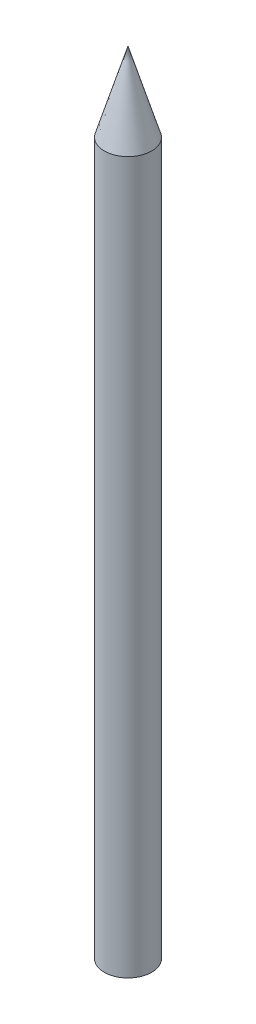
ISO-10303-21;
HEADER;
FILE_DESCRIPTION(('STEP AP214'),'2;1');
FILE_NAME('part.step','',(''),(''),'','','');
FILE_SCHEMA(('AUTOMOTIVE_DESIGN { 1 0 10303 214 1 1 1 1 }'));
ENDSEC;
DATA;
#1=APPLICATION_CONTEXT('core data for automotive mechanical design processes');
#2=APPLICATION_PROTOCOL_DEFINITION('international standard','automotive_design',2000,#1);
#3=PRODUCT_CONTEXT('',#1,'mechanical');
#4=PRODUCT('Part','Part','',(#3));
#5=PRODUCT_RELATED_PRODUCT_CATEGORY('part','',(#4));
#6=PRODUCT_DEFINITION_FORMATION('','',#4);
#7=PRODUCT_DEFINITION_CONTEXT('part definition',#1,'design');
#8=PRODUCT_DEFINITION('design','',#6,#7);
#9=PRODUCT_DEFINITION_SHAPE('','',#8);
#10=(LENGTH_UNIT() NAMED_UNIT(*) SI_UNIT(.MILLI.,.METRE.));
#11=(NAMED_UNIT(*) PLANE_ANGLE_UNIT() SI_UNIT($,.RADIAN.));
#12=(NAMED_UNIT(*) SI_UNIT($,.STERADIAN.) SOLID_ANGLE_UNIT());
#13=UNCERTAINTY_MEASURE_WITH_UNIT(LENGTH_MEASURE(1.E-05),#10,'distance_accuracy_value','');
#14=(GEOMETRIC_REPRESENTATION_CONTEXT(3) GLOBAL_UNCERTAINTY_ASSIGNED_CONTEXT((#13)) GLOBAL_UNIT_ASSIGNED_CONTEXT((#10,
#11,#12)) REPRESENTATION_CONTEXT('',''));
#15=CARTESIAN_POINT('',(0.,0.,0.));
#16=DIRECTION('',(0.,0.,1.));
#17=DIRECTION('',(1.,0.,0.));
#18=AXIS2_PLACEMENT_3D('',#15,#16,#17);
#19=CARTESIAN_POINT('',(0.,0.,0.));
#20=DIRECTION('',(0.,1.,0.));
#21=DIRECTION('',(0.,0.,1.));
#22=AXIS2_PLACEMENT_3D('',#19,#20,#21);
#23=PLANE('',#22);
#24=CARTESIAN_POINT('',(0.,0.,0.));
#25=DIRECTION('',(0.,1.,0.));
#26=DIRECTION('',(0.,0.,1.));
#27=AXIS2_PLACEMENT_3D('',#24,#25,#26);
#28=CIRCLE('',#27,0.3);
#29=CARTESIAN_POINT('',(0.,0.,0.3));
#30=VERTEX_POINT('',#29);
#31=EDGE_CURVE('E20',#30,#30,#28,.T.);
#32=ORIENTED_EDGE('',*,*,#31,.F.);
#33=EDGE_LOOP('',(#32));
#34=FACE_BOUND('',#33,.T.);
#35=ADVANCED_FACE('F17',(#34),#23,.F.);
#36=CARTESIAN_POINT('',(0.,9.0000000000714,0.));
#37=DIRECTION('',(0.,-1.,0.));
#38=DIRECTION('',(0.,0.,-1.));
#39=AXIS2_PLACEMENT_3D('',#36,#37,#38);
#40=CONICAL_SURFACE('',#39,0.299999999981537,0.291456794170183);
#41=CARTESIAN_POINT('',(1.4210854715202E-11,10.0000000002183,0.));
#42=VERTEX_POINT('',#41);
#43=VERTEX_LOOP('',#42);
#44=FACE_BOUND('',#43,.T.);
#45=CARTESIAN_POINT('',(0.,9.,0.));
#46=DIRECTION('',(0.,1.,0.));
#47=DIRECTION('',(0.,0.,1.));
#48=AXIS2_PLACEMENT_3D('',#45,#46,#47);
#49=CIRCLE('',#48,0.3);
#50=CARTESIAN_POINT('',(0.,9.,0.3));
#51=VERTEX_POINT('',#50);
#52=EDGE_CURVE('E11',#51,#51,#49,.F.);
#53=ORIENTED_EDGE('',*,*,#52,.F.);
#54=EDGE_LOOP('',(#53));
#55=FACE_BOUND('',#54,.T.);
#56=ADVANCED_FACE('F26',(#44,#55),#40,.T.);
#57=CARTESIAN_POINT('',(0.,0.,0.));
#58=DIRECTION('',(0.,1.,0.));
#59=DIRECTION('',(0.,0.,1.));
#60=AXIS2_PLACEMENT_3D('',#57,#58,#59);
#61=CYLINDRICAL_SURFACE('',#60,0.3);
#62=ORIENTED_EDGE('',*,*,#31,.T.);
#63=EDGE_LOOP('',(#62));
#64=FACE_BOUND('',#63,.T.);
#65=ORIENTED_EDGE('',*,*,#52,.T.);
#66=EDGE_LOOP('',(#65));
#67=FACE_BOUND('',#66,.T.);
#68=ADVANCED_FACE('F29',(#64,#67),#61,.T.);
#69=CLOSED_SHELL('',(#35,#56,#68));
#70=MANIFOLD_SOLID_BREP('B1',#69);
#71=ADVANCED_BREP_SHAPE_REPRESENTATION('',(#18,#70),#14);
#72=SHAPE_DEFINITION_REPRESENTATION(#9,#71);
ENDSEC;
END-ISO-10303-21;
